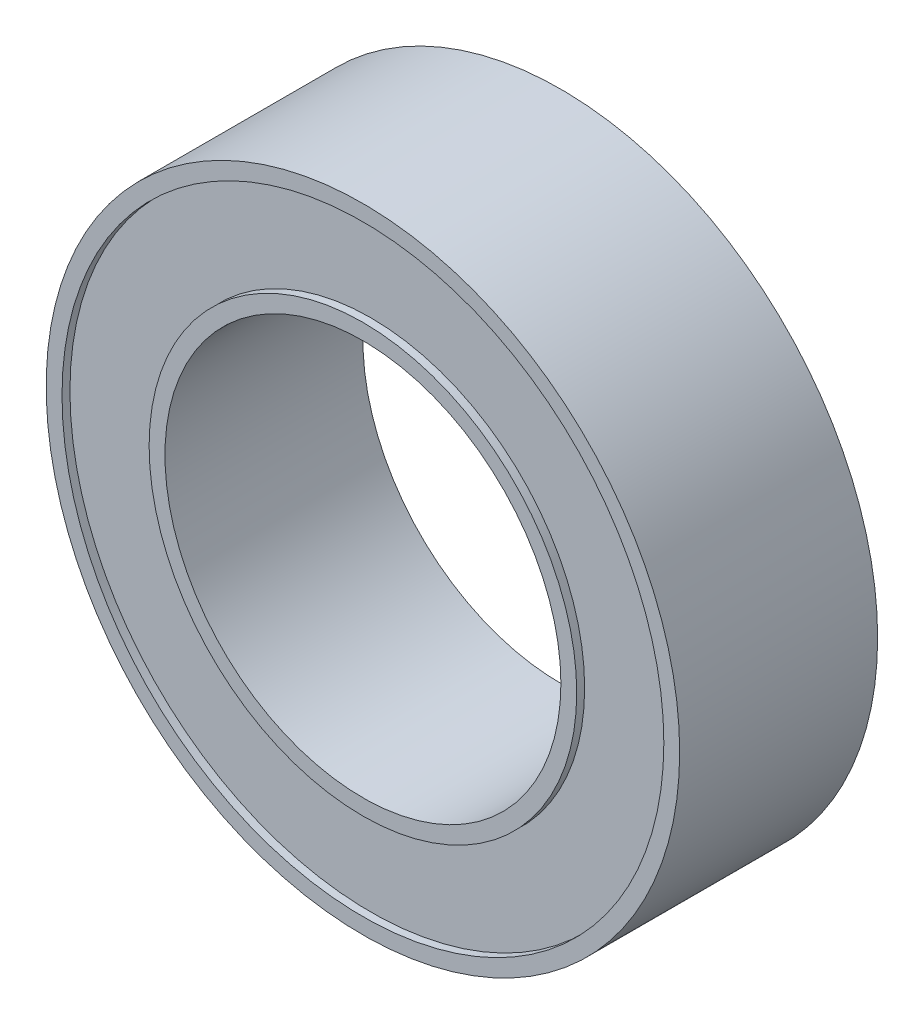
ISO-10303-21;
HEADER;
FILE_DESCRIPTION(('STEP AP214'),'2;1');
FILE_NAME('part.step','',(''),(''),'','','');
FILE_SCHEMA(('AUTOMOTIVE_DESIGN { 1 0 10303 214 1 1 1 1 }'));
ENDSEC;
DATA;
#1=APPLICATION_CONTEXT('core data for automotive mechanical design processes');
#2=APPLICATION_PROTOCOL_DEFINITION('international standard','automotive_design',2000,#1);
#3=PRODUCT_CONTEXT('',#1,'mechanical');
#4=PRODUCT('Part','Part','',(#3));
#5=PRODUCT_RELATED_PRODUCT_CATEGORY('part','',(#4));
#6=PRODUCT_DEFINITION_FORMATION('','',#4);
#7=PRODUCT_DEFINITION_CONTEXT('part definition',#1,'design');
#8=PRODUCT_DEFINITION('design','',#6,#7);
#9=PRODUCT_DEFINITION_SHAPE('','',#8);
#10=(LENGTH_UNIT() NAMED_UNIT(*) SI_UNIT(.MILLI.,.METRE.));
#11=(NAMED_UNIT(*) PLANE_ANGLE_UNIT() SI_UNIT($,.RADIAN.));
#12=(NAMED_UNIT(*) SI_UNIT($,.STERADIAN.) SOLID_ANGLE_UNIT());
#13=UNCERTAINTY_MEASURE_WITH_UNIT(LENGTH_MEASURE(1.E-05),#10,'distance_accuracy_value','');
#14=(GEOMETRIC_REPRESENTATION_CONTEXT(3) GLOBAL_UNCERTAINTY_ASSIGNED_CONTEXT((#13)) GLOBAL_UNIT_ASSIGNED_CONTEXT((#10,
#11,#12)) REPRESENTATION_CONTEXT('',''));
#15=CARTESIAN_POINT('',(0.,0.,0.));
#16=DIRECTION('',(0.,0.,1.));
#17=DIRECTION('',(1.,0.,0.));
#18=AXIS2_PLACEMENT_3D('',#15,#16,#17);
#19=CARTESIAN_POINT('',(0.,0.,-1.25));
#20=DIRECTION('',(0.,0.,1.));
#21=DIRECTION('',(1.,0.,0.));
#22=AXIS2_PLACEMENT_3D('',#19,#20,#21);
#23=PLANE('',#22);
#24=CARTESIAN_POINT('',(0.,0.,-1.25));
#25=DIRECTION('',(0.,0.,1.));
#26=DIRECTION('',(1.,0.,0.));
#27=AXIS2_PLACEMENT_3D('',#24,#25,#26);
#28=CIRCLE('',#27,2.5);
#29=CARTESIAN_POINT('',(2.5,0.,-1.25));
#30=VERTEX_POINT('',#29);
#31=EDGE_CURVE('E49',#30,#30,#28,.T.);
#32=ORIENTED_EDGE('',*,*,#31,.T.);
#33=EDGE_LOOP('',(#32));
#34=FACE_BOUND('',#33,.T.);
#35=CARTESIAN_POINT('',(0.,0.,-1.25));
#36=DIRECTION('',(0.,0.,1.));
#37=DIRECTION('',(1.,0.,0.));
#38=AXIS2_PLACEMENT_3D('',#35,#36,#37);
#39=CIRCLE('',#38,2.7);
#40=CARTESIAN_POINT('',(2.7,0.,-1.25));
#41=VERTEX_POINT('',#40);
#42=EDGE_CURVE('E74',#41,#41,#39,.T.);
#43=ORIENTED_EDGE('',*,*,#42,.F.);
#44=EDGE_LOOP('',(#43));
#45=FACE_BOUND('',#44,.T.);
#46=ADVANCED_FACE('F40',(#34,#45),#23,.F.);
#47=CARTESIAN_POINT('',(0.,0.,1.25));
#48=DIRECTION('',(0.,0.,1.));
#49=DIRECTION('',(1.,0.,0.));
#50=AXIS2_PLACEMENT_3D('',#47,#48,#49);
#51=PLANE('',#50);
#52=CARTESIAN_POINT('',(0.,0.,1.25));
#53=DIRECTION('',(0.,0.,1.));
#54=DIRECTION('',(1.,0.,0.));
#55=AXIS2_PLACEMENT_3D('',#52,#53,#54);
#56=CIRCLE('',#55,2.5);
#57=CARTESIAN_POINT('',(2.5,0.,1.25));
#58=VERTEX_POINT('',#57);
#59=EDGE_CURVE('E48',#58,#58,#56,.T.);
#60=ORIENTED_EDGE('',*,*,#59,.F.);
#61=EDGE_LOOP('',(#60));
#62=FACE_BOUND('',#61,.T.);
#63=CARTESIAN_POINT('',(0.,0.,1.25));
#64=DIRECTION('',(0.,0.,1.));
#65=DIRECTION('',(1.,0.,0.));
#66=AXIS2_PLACEMENT_3D('',#63,#64,#65);
#67=CIRCLE('',#66,2.7);
#68=CARTESIAN_POINT('',(2.7,0.,1.25));
#69=VERTEX_POINT('',#68);
#70=EDGE_CURVE('E65',#69,#69,#67,.T.);
#71=ORIENTED_EDGE('',*,*,#70,.T.);
#72=EDGE_LOOP('',(#71));
#73=FACE_BOUND('',#72,.T.);
#74=ADVANCED_FACE('F89',(#62,#73),#51,.T.);
#75=CARTESIAN_POINT('',(0.,0.,1.25));
#76=DIRECTION('',(0.,0.,1.));
#77=DIRECTION('',(1.,0.,0.));
#78=AXIS2_PLACEMENT_3D('',#75,#76,#77);
#79=CIRCLE('',#78,3.8);
#80=CARTESIAN_POINT('',(3.8,0.,1.25));
#81=VERTEX_POINT('',#80);
#82=EDGE_CURVE('E57',#81,#81,#79,.T.);
#83=ORIENTED_EDGE('',*,*,#82,.F.);
#84=EDGE_LOOP('',(#83));
#85=FACE_BOUND('',#84,.T.);
#86=CARTESIAN_POINT('',(0.,0.,1.25));
#87=DIRECTION('',(0.,0.,1.));
#88=DIRECTION('',(1.,0.,0.));
#89=AXIS2_PLACEMENT_3D('',#86,#87,#88);
#90=CIRCLE('',#89,4.);
#91=CARTESIAN_POINT('',(4.,0.,1.25));
#92=VERTEX_POINT('',#91);
#93=EDGE_CURVE('E10',#92,#92,#90,.T.);
#94=ORIENTED_EDGE('',*,*,#93,.T.);
#95=EDGE_LOOP('',(#94));
#96=FACE_BOUND('',#95,.T.);
#97=ADVANCED_FACE('F98',(#85,#96),#51,.T.);
#98=CARTESIAN_POINT('',(0.,0.,-1.25));
#99=DIRECTION('',(0.,0.,1.));
#100=DIRECTION('',(1.,0.,0.));
#101=AXIS2_PLACEMENT_3D('',#98,#99,#100);
#102=CIRCLE('',#101,3.8);
#103=CARTESIAN_POINT('',(3.8,0.,-1.25));
#104=VERTEX_POINT('',#103);
#105=EDGE_CURVE('E68',#104,#104,#102,.T.);
#106=ORIENTED_EDGE('',*,*,#105,.T.);
#107=EDGE_LOOP('',(#106));
#108=FACE_BOUND('',#107,.T.);
#109=CARTESIAN_POINT('',(0.,0.,-1.25));
#110=DIRECTION('',(0.,0.,1.));
#111=DIRECTION('',(1.,0.,0.));
#112=AXIS2_PLACEMENT_3D('',#109,#110,#111);
#113=CIRCLE('',#112,4.);
#114=CARTESIAN_POINT('',(4.,0.,-1.25));
#115=VERTEX_POINT('',#114);
#116=EDGE_CURVE('E41',#115,#115,#113,.T.);
#117=ORIENTED_EDGE('',*,*,#116,.F.);
#118=EDGE_LOOP('',(#117));
#119=FACE_BOUND('',#118,.T.);
#120=ADVANCED_FACE('F95',(#108,#119),#23,.F.);
#121=CARTESIAN_POINT('',(0.,0.,1.25));
#122=DIRECTION('',(0.,0.,-1.));
#123=DIRECTION('',(-1.,0.,0.));
#124=AXIS2_PLACEMENT_3D('',#121,#122,#123);
#125=CYLINDRICAL_SURFACE('',#124,4.);
#126=ORIENTED_EDGE('',*,*,#93,.F.);
#127=EDGE_LOOP('',(#126));
#128=FACE_BOUND('',#127,.T.);
#129=ORIENTED_EDGE('',*,*,#116,.T.);
#130=EDGE_LOOP('',(#129));
#131=FACE_BOUND('',#130,.T.);
#132=ADVANCED_FACE('F39',(#128,#131),#125,.T.);
#133=CARTESIAN_POINT('',(0.,0.,1.25));
#134=DIRECTION('',(0.,0.,-1.));
#135=DIRECTION('',(-1.,0.,0.));
#136=AXIS2_PLACEMENT_3D('',#133,#134,#135);
#137=CYLINDRICAL_SURFACE('',#136,2.5);
#138=ORIENTED_EDGE('',*,*,#59,.T.);
#139=EDGE_LOOP('',(#138));
#140=FACE_BOUND('',#139,.T.);
#141=ORIENTED_EDGE('',*,*,#31,.F.);
#142=EDGE_LOOP('',(#141));
#143=FACE_BOUND('',#142,.T.);
#144=ADVANCED_FACE('F106',(#140,#143),#137,.F.);
#145=CARTESIAN_POINT('',(0.,0.,1.15));
#146=DIRECTION('',(0.,0.,1.));
#147=DIRECTION('',(1.,0.,0.));
#148=AXIS2_PLACEMENT_3D('',#145,#146,#147);
#149=CYLINDRICAL_SURFACE('',#148,3.8);
#150=CARTESIAN_POINT('',(0.,0.,1.15));
#151=DIRECTION('',(0.,0.,1.));
#152=DIRECTION('',(1.,0.,0.));
#153=AXIS2_PLACEMENT_3D('',#150,#151,#152);
#154=CIRCLE('',#153,3.8);
#155=CARTESIAN_POINT('',(3.8,0.,1.15));
#156=VERTEX_POINT('',#155);
#157=EDGE_CURVE('E52',#156,#156,#154,.T.);
#158=ORIENTED_EDGE('',*,*,#157,.F.);
#159=EDGE_LOOP('',(#158));
#160=FACE_BOUND('',#159,.T.);
#161=ORIENTED_EDGE('',*,*,#82,.T.);
#162=EDGE_LOOP('',(#161));
#163=FACE_BOUND('',#162,.T.);
#164=ADVANCED_FACE('F129',(#160,#163),#149,.F.);
#165=CARTESIAN_POINT('',(0.,0.,1.15));
#166=DIRECTION('',(0.,0.,1.));
#167=DIRECTION('',(1.,0.,0.));
#168=AXIS2_PLACEMENT_3D('',#165,#166,#167);
#169=PLANE('',#168);
#170=CARTESIAN_POINT('',(0.,0.,1.15));
#171=DIRECTION('',(0.,0.,1.));
#172=DIRECTION('',(1.,0.,0.));
#173=AXIS2_PLACEMENT_3D('',#170,#171,#172);
#174=CIRCLE('',#173,2.7);
#175=CARTESIAN_POINT('',(2.7,0.,1.15));
#176=VERTEX_POINT('',#175);
#177=EDGE_CURVE('E56',#176,#176,#174,.T.);
#178=ORIENTED_EDGE('',*,*,#177,.F.);
#179=EDGE_LOOP('',(#178));
#180=FACE_BOUND('',#179,.T.);
#181=ORIENTED_EDGE('',*,*,#157,.T.);
#182=EDGE_LOOP('',(#181));
#183=FACE_BOUND('',#182,.T.);
#184=ADVANCED_FACE('F124',(#180,#183),#169,.T.);
#185=CARTESIAN_POINT('',(0.,0.,1.15));
#186=DIRECTION('',(0.,0.,1.));
#187=DIRECTION('',(1.,0.,0.));
#188=AXIS2_PLACEMENT_3D('',#185,#186,#187);
#189=CYLINDRICAL_SURFACE('',#188,2.7);
#190=ORIENTED_EDGE('',*,*,#177,.T.);
#191=EDGE_LOOP('',(#190));
#192=FACE_BOUND('',#191,.T.);
#193=ORIENTED_EDGE('',*,*,#70,.F.);
#194=EDGE_LOOP('',(#193));
#195=FACE_BOUND('',#194,.T.);
#196=ADVANCED_FACE('F118',(#192,#195),#189,.T.);
#197=CARTESIAN_POINT('',(0.,0.,-1.15));
#198=DIRECTION('',(0.,0.,-1.));
#199=DIRECTION('',(1.,0.,0.));
#200=AXIS2_PLACEMENT_3D('',#197,#198,#199);
#201=PLANE('',#200);
#202=CARTESIAN_POINT('',(0.,0.,-1.15));
#203=DIRECTION('',(0.,0.,1.));
#204=DIRECTION('',(1.,0.,0.));
#205=AXIS2_PLACEMENT_3D('',#202,#203,#204);
#206=CIRCLE('',#205,3.8);
#207=CARTESIAN_POINT('',(3.8,0.,-1.15));
#208=VERTEX_POINT('',#207);
#209=EDGE_CURVE('E63',#208,#208,#206,.T.);
#210=ORIENTED_EDGE('',*,*,#209,.F.);
#211=EDGE_LOOP('',(#210));
#212=FACE_BOUND('',#211,.T.);
#213=CARTESIAN_POINT('',(0.,0.,-1.15));
#214=DIRECTION('',(0.,0.,1.));
#215=DIRECTION('',(1.,0.,0.));
#216=AXIS2_PLACEMENT_3D('',#213,#214,#215);
#217=CIRCLE('',#216,2.7);
#218=CARTESIAN_POINT('',(2.7,0.,-1.15));
#219=VERTEX_POINT('',#218);
#220=EDGE_CURVE('E72',#219,#219,#217,.T.);
#221=ORIENTED_EDGE('',*,*,#220,.T.);
#222=EDGE_LOOP('',(#221));
#223=FACE_BOUND('',#222,.T.);
#224=ADVANCED_FACE('F78',(#212,#223),#201,.T.);
#225=CARTESIAN_POINT('',(0.,0.,-1.15));
#226=DIRECTION('',(0.,0.,-1.));
#227=DIRECTION('',(-1.,0.,0.));
#228=AXIS2_PLACEMENT_3D('',#225,#226,#227);
#229=CYLINDRICAL_SURFACE('',#228,3.8);
#230=ORIENTED_EDGE('',*,*,#209,.T.);
#231=EDGE_LOOP('',(#230));
#232=FACE_BOUND('',#231,.T.);
#233=ORIENTED_EDGE('',*,*,#105,.F.);
#234=EDGE_LOOP('',(#233));
#235=FACE_BOUND('',#234,.T.);
#236=ADVANCED_FACE('F84',(#232,#235),#229,.F.);
#237=CARTESIAN_POINT('',(0.,0.,-1.15));
#238=DIRECTION('',(0.,0.,-1.));
#239=DIRECTION('',(-1.,0.,0.));
#240=AXIS2_PLACEMENT_3D('',#237,#238,#239);
#241=CYLINDRICAL_SURFACE('',#240,2.7);
#242=ORIENTED_EDGE('',*,*,#220,.F.);
#243=EDGE_LOOP('',(#242));
#244=FACE_BOUND('',#243,.T.);
#245=ORIENTED_EDGE('',*,*,#42,.T.);
#246=EDGE_LOOP('',(#245));
#247=FACE_BOUND('',#246,.T.);
#248=ADVANCED_FACE('F85',(#244,#247),#241,.T.);
#249=CLOSED_SHELL('',(#46,#74,#97,#120,#132,#144,#164,#184,#196,#224,#236,#248));
#250=MANIFOLD_SOLID_BREP('B2',#249);
#251=ADVANCED_BREP_SHAPE_REPRESENTATION('',(#18,#250),#14);
#252=SHAPE_DEFINITION_REPRESENTATION(#9,#251);
ENDSEC;
END-ISO-10303-21;
